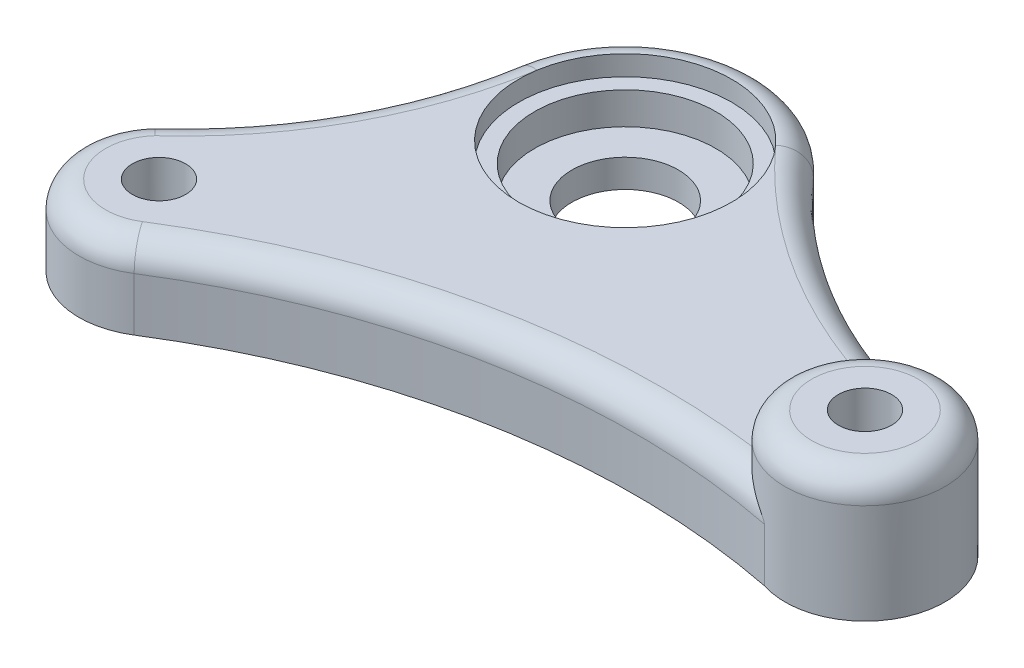
ISO-10303-21;
HEADER;
FILE_DESCRIPTION(('STEP AP214'),'2;1');
FILE_NAME('part.step','',(''),(''),'','','');
FILE_SCHEMA(('AUTOMOTIVE_DESIGN { 1 0 10303 214 1 1 1 1 }'));
ENDSEC;
DATA;
#1=APPLICATION_CONTEXT('core data for automotive mechanical design processes');
#2=APPLICATION_PROTOCOL_DEFINITION('international standard','automotive_design',2000,#1);
#3=PRODUCT_CONTEXT('',#1,'mechanical');
#4=PRODUCT('Part','Part','',(#3));
#5=PRODUCT_RELATED_PRODUCT_CATEGORY('part','',(#4));
#6=PRODUCT_DEFINITION_FORMATION('','',#4);
#7=PRODUCT_DEFINITION_CONTEXT('part definition',#1,'design');
#8=PRODUCT_DEFINITION('design','',#6,#7);
#9=PRODUCT_DEFINITION_SHAPE('','',#8);
#10=(LENGTH_UNIT() NAMED_UNIT(*) SI_UNIT(.MILLI.,.METRE.));
#11=(NAMED_UNIT(*) PLANE_ANGLE_UNIT() SI_UNIT($,.RADIAN.));
#12=(NAMED_UNIT(*) SI_UNIT($,.STERADIAN.) SOLID_ANGLE_UNIT());
#13=UNCERTAINTY_MEASURE_WITH_UNIT(LENGTH_MEASURE(1.E-05),#10,'distance_accuracy_value','');
#14=(GEOMETRIC_REPRESENTATION_CONTEXT(3) GLOBAL_UNCERTAINTY_ASSIGNED_CONTEXT((#13)) GLOBAL_UNIT_ASSIGNED_CONTEXT((#10,
#11,#12)) REPRESENTATION_CONTEXT('',''));
#15=CARTESIAN_POINT('',(0.,0.,0.));
#16=DIRECTION('',(0.,0.,1.));
#17=DIRECTION('',(1.,0.,0.));
#18=AXIS2_PLACEMENT_3D('',#15,#16,#17);
#19=CARTESIAN_POINT('',(30.,-6.,12.));
#20=DIRECTION('',(0.,1.,0.));
#21=DIRECTION('',(0.,0.,1.));
#22=AXIS2_PLACEMENT_3D('',#19,#20,#21);
#23=CYLINDRICAL_SURFACE('',#22,2.);
#24=CARTESIAN_POINT('',(30.,9.5,12.));
#25=DIRECTION('',(0.,1.,0.));
#26=DIRECTION('',(0.,0.,1.));
#27=AXIS2_PLACEMENT_3D('',#24,#25,#26);
#28=CIRCLE('',#27,2.);
#29=CARTESIAN_POINT('',(30.,9.5,14.));
#30=VERTEX_POINT('',#29);
#31=EDGE_CURVE('E241',#30,#30,#28,.T.);
#32=ORIENTED_EDGE('',*,*,#31,.T.);
#33=EDGE_LOOP('',(#32));
#34=FACE_BOUND('',#33,.T.);
#35=CARTESIAN_POINT('',(30.,2.,12.));
#36=DIRECTION('',(0.,-1.,0.));
#37=DIRECTION('',(0.,0.,-1.));
#38=AXIS2_PLACEMENT_3D('',#35,#36,#37);
#39=CIRCLE('',#38,2.);
#40=CARTESIAN_POINT('',(30.,2.,10.));
#41=VERTEX_POINT('',#40);
#42=EDGE_CURVE('E48',#41,#41,#39,.F.);
#43=ORIENTED_EDGE('',*,*,#42,.F.);
#44=EDGE_LOOP('',(#43));
#45=FACE_BOUND('',#44,.T.);
#46=ADVANCED_FACE('F43',(#34,#45),#23,.F.);
#47=CARTESIAN_POINT('',(-15.,-6.,20.));
#48=DIRECTION('',(0.,1.,0.));
#49=DIRECTION('',(0.,0.,1.));
#50=AXIS2_PLACEMENT_3D('',#47,#48,#49);
#51=CYLINDRICAL_SURFACE('',#50,2.);
#52=CARTESIAN_POINT('',(-15.,6.,20.));
#53=DIRECTION('',(0.,1.,0.));
#54=DIRECTION('',(0.,0.,1.));
#55=AXIS2_PLACEMENT_3D('',#52,#53,#54);
#56=CIRCLE('',#55,2.);
#57=CARTESIAN_POINT('',(-15.,6.,22.));
#58=VERTEX_POINT('',#57);
#59=EDGE_CURVE('E288',#58,#58,#56,.T.);
#60=ORIENTED_EDGE('',*,*,#59,.T.);
#61=EDGE_LOOP('',(#60));
#62=FACE_BOUND('',#61,.T.);
#63=CARTESIAN_POINT('',(-15.,2.,20.));
#64=DIRECTION('',(0.,-1.,0.));
#65=DIRECTION('',(0.,0.,-1.));
#66=AXIS2_PLACEMENT_3D('',#63,#64,#65);
#67=CIRCLE('',#66,2.);
#68=CARTESIAN_POINT('',(-15.,2.,18.));
#69=VERTEX_POINT('',#68);
#70=EDGE_CURVE('E249',#69,#69,#67,.F.);
#71=ORIENTED_EDGE('',*,*,#70,.F.);
#72=EDGE_LOOP('',(#71));
#73=FACE_BOUND('',#72,.T.);
#74=ADVANCED_FACE('F350',(#62,#73),#51,.F.);
#75=CARTESIAN_POINT('',(0.,-6.,0.));
#76=DIRECTION('',(0.,1.,0.));
#77=DIRECTION('',(0.,0.,1.));
#78=AXIS2_PLACEMENT_3D('',#75,#76,#77);
#79=CYLINDRICAL_SURFACE('',#78,4.);
#80=CARTESIAN_POINT('',(0.,0.,0.));
#81=DIRECTION('',(0.,1.,0.));
#82=DIRECTION('',(0.,0.,1.));
#83=AXIS2_PLACEMENT_3D('',#80,#81,#82);
#84=CIRCLE('',#83,4.);
#85=CARTESIAN_POINT('',(0.,0.,4.));
#86=VERTEX_POINT('',#85);
#87=EDGE_CURVE('E292',#86,#86,#84,.T.);
#88=ORIENTED_EDGE('',*,*,#87,.F.);
#89=EDGE_LOOP('',(#88));
#90=FACE_BOUND('',#89,.T.);
#91=CARTESIAN_POINT('',(0.,2.1,0.));
#92=DIRECTION('',(0.,1.,0.));
#93=DIRECTION('',(0.,0.,1.));
#94=AXIS2_PLACEMENT_3D('',#91,#92,#93);
#95=CIRCLE('',#94,4.);
#96=CARTESIAN_POINT('',(0.,2.1,4.));
#97=VERTEX_POINT('',#96);
#98=EDGE_CURVE('E141',#97,#97,#95,.F.);
#99=ORIENTED_EDGE('',*,*,#98,.F.);
#100=EDGE_LOOP('',(#99));
#101=FACE_BOUND('',#100,.T.);
#102=ADVANCED_FACE('F212',(#90,#101),#79,.F.);
#103=CARTESIAN_POINT('',(-15.,6.,20.));
#104=DIRECTION('',(0.,-1.,0.));
#105=DIRECTION('',(0.,0.,-1.));
#106=AXIS2_PLACEMENT_3D('',#103,#104,#105);
#107=CYLINDRICAL_SURFACE('',#106,6.);
#108=DIRECTION('',(0.,-1.,0.));
#109=VECTOR('',#108,1.);
#110=CARTESIAN_POINT('',(-11.7911078254641,6.,25.0698137058675));
#111=LINE('',#110,#109);
#112=CARTESIAN_POINT('',(-11.7911078254641,4.,25.0698137058675));
#113=VERTEX_POINT('',#112);
#114=CARTESIAN_POINT('',(-11.7911078254641,0.,25.0698137058675));
#115=VERTEX_POINT('',#114);
#116=EDGE_CURVE('E332',#113,#115,#111,.T.);
#117=ORIENTED_EDGE('',*,*,#116,.F.);
#118=CARTESIAN_POINT('',(-15.,4.,20.));
#119=DIRECTION('',(0.,1.,0.));
#120=DIRECTION('',(0.,0.,1.));
#121=AXIS2_PLACEMENT_3D('',#118,#119,#120);
#122=CIRCLE('',#121,6.);
#123=CARTESIAN_POINT('',(-19.3894219726827,4.,15.9094041087233));
#124=VERTEX_POINT('',#123);
#125=EDGE_CURVE('E62',#113,#124,#122,.F.);
#126=ORIENTED_EDGE('',*,*,#125,.T.);
#127=DIRECTION('',(0.,-1.,0.));
#128=VECTOR('',#127,1.);
#129=CARTESIAN_POINT('',(-19.3894219726827,6.,15.9094041087233));
#130=LINE('',#129,#128);
#131=CARTESIAN_POINT('',(-19.3894219726827,0.,15.9094041087233));
#132=VERTEX_POINT('',#131);
#133=EDGE_CURVE('E317',#124,#132,#130,.T.);
#134=ORIENTED_EDGE('',*,*,#133,.T.);
#135=CARTESIAN_POINT('',(-15.,0.,20.));
#136=DIRECTION('',(0.,1.,0.));
#137=DIRECTION('',(0.,0.,1.));
#138=AXIS2_PLACEMENT_3D('',#135,#136,#137);
#139=CIRCLE('',#138,6.);
#140=EDGE_CURVE('E293',#132,#115,#139,.T.);
#141=ORIENTED_EDGE('',*,*,#140,.T.);
#142=EDGE_LOOP('',(#117,#126,#134,#141));
#143=FACE_BOUND('',#142,.T.);
#144=ADVANCED_FACE('F209',(#143),#107,.T.);
#145=CARTESIAN_POINT('',(17.4436155004631,6.,71.6566246297384));
#146=DIRECTION('',(0.,-1.,0.));
#147=DIRECTION('',(0.,0.,-1.));
#148=AXIS2_PLACEMENT_3D('',#145,#146,#147);
#149=CYLINDRICAL_SURFACE('',#148,55.);
#150=DIRECTION('',(0.,-1.,0.));
#151=VECTOR('',#150,1.);
#152=CARTESIAN_POINT('',(28.1586438163136,6.,17.7104647275681));
#153=LINE('',#152,#151);
#154=CARTESIAN_POINT('',(28.1586438163136,4.,17.7104647275681));
#155=VERTEX_POINT('',#154);
#156=CARTESIAN_POINT('',(28.1586438163136,0.,17.7104647275681));
#157=VERTEX_POINT('',#156);
#158=EDGE_CURVE('E329',#155,#157,#153,.T.);
#159=ORIENTED_EDGE('',*,*,#158,.F.);
#160=CARTESIAN_POINT('',(17.4436155004631,4.,71.6566246297384));
#161=DIRECTION('',(0.,1.,0.));
#162=DIRECTION('',(0.,0.,1.));
#163=AXIS2_PLACEMENT_3D('',#160,#161,#162);
#164=CIRCLE('',#163,55.);
#165=EDGE_CURVE('E70',#155,#113,#164,.T.);
#166=ORIENTED_EDGE('',*,*,#165,.T.);
#167=ORIENTED_EDGE('',*,*,#116,.T.);
#168=CARTESIAN_POINT('',(17.4436155004631,0.,71.6566246297384));
#169=DIRECTION('',(0.,1.,0.));
#170=DIRECTION('',(0.,0.,1.));
#171=AXIS2_PLACEMENT_3D('',#168,#169,#170);
#172=CIRCLE('',#171,55.);
#173=EDGE_CURVE('E297',#115,#157,#172,.F.);
#174=ORIENTED_EDGE('',*,*,#173,.T.);
#175=EDGE_LOOP('',(#159,#166,#167,#174));
#176=FACE_BOUND('',#175,.T.);
#177=ADVANCED_FACE('F203',(#176),#149,.F.);
#178=CARTESIAN_POINT('',(30.,6.,12.));
#179=DIRECTION('',(0.,-1.,0.));
#180=DIRECTION('',(0.,0.,-1.));
#181=AXIS2_PLACEMENT_3D('',#178,#179,#180);
#182=CYLINDRICAL_SURFACE('',#181,6.);
#183=CARTESIAN_POINT('',(30.,7.5,12.));
#184=DIRECTION('',(0.,1.,0.));
#185=DIRECTION('',(0.,0.,1.));
#186=AXIS2_PLACEMENT_3D('',#183,#184,#185);
#187=CIRCLE('',#186,6.);
#188=CARTESIAN_POINT('',(30.,7.5,18.));
#189=VERTEX_POINT('',#188);
#190=EDGE_CURVE('E158',#189,#189,#187,.F.);
#191=ORIENTED_EDGE('',*,*,#190,.T.);
#192=EDGE_LOOP('',(#191));
#193=FACE_BOUND('',#192,.T.);
#194=CARTESIAN_POINT('',(30.,0.,12.));
#195=DIRECTION('',(0.,1.,0.));
#196=DIRECTION('',(0.,0.,1.));
#197=AXIS2_PLACEMENT_3D('',#194,#195,#196);
#198=CIRCLE('',#197,6.);
#199=CARTESIAN_POINT('',(30.9358441673114,0.,6.07343305998242));
#200=VERTEX_POINT('',#199);
#201=EDGE_CURVE('E301',#157,#200,#198,.T.);
#202=ORIENTED_EDGE('',*,*,#201,.T.);
#203=DIRECTION('',(0.,-1.,0.));
#204=VECTOR('',#203,1.);
#205=CARTESIAN_POINT('',(30.9358441673114,6.,6.07343305998242));
#206=LINE('',#205,#204);
#207=CARTESIAN_POINT('',(30.9358441673114,4.,6.07343305998242));
#208=VERTEX_POINT('',#207);
#209=EDGE_CURVE('E326',#208,#200,#206,.T.);
#210=ORIENTED_EDGE('',*,*,#209,.F.);
#211=CARTESIAN_POINT('',(26.4422950298681,6.,7.1685679819024));
#212=CARTESIAN_POINT('',(26.5108958757786,5.99999217569696,7.11804353439624));
#213=CARTESIAN_POINT('',(26.5805182447149,5.99669757475214,7.0690394379751));
#214=CARTESIAN_POINT('',(26.7213162048496,5.98424512800573,6.97432567219821));
#215=CARTESIAN_POINT('',(26.7924893122863,5.97509607541142,6.92861117632336));
#216=CARTESIAN_POINT('',(27.0065840147243,5.94013063010631,6.7973773681705));
#217=CARTESIAN_POINT('',(27.1513656207753,5.90676885624995,6.71682617980917));
#218=CARTESIAN_POINT('',(27.4142861444252,5.8327201310213,6.58416075317519));
#219=CARTESIAN_POINT('',(27.5320152639609,5.79479751815587,6.52957495178523));
#220=CARTESIAN_POINT('',(27.7683245052312,5.71090841476885,6.42899426657882));
#221=CARTESIAN_POINT('',(27.8869049446484,5.66493875383245,6.38300278361419));
#222=CARTESIAN_POINT('',(28.1250472683951,5.56625312238299,6.29907003803959));
#223=CARTESIAN_POINT('',(28.2446105904401,5.51349601455972,6.261181961654));
#224=CARTESIAN_POINT('',(28.4836174790928,5.40276695810095,6.19345063681758));
#225=CARTESIAN_POINT('',(28.6030609950147,5.34479334293644,6.16360997154757));
#226=CARTESIAN_POINT('',(28.9093741033857,5.19057574289728,6.09684795470304));
#227=CARTESIAN_POINT('',(29.0959643577461,5.09131484729659,6.06554858421318));
#228=CARTESIAN_POINT('',(29.4675695584835,4.88593307766774,6.02073808936542));
#229=CARTESIAN_POINT('',(29.6525832800202,4.77980733817671,6.00723972966211));
#230=CARTESIAN_POINT('',(30.0200402080417,4.56363667308852,5.99722673180348));
#231=CARTESIAN_POINT('',(30.2024891149856,4.45360341712494,6.00066515532779));
#232=CARTESIAN_POINT('',(30.5649755963695,4.23157225614716,6.02390174380439));
#233=CARTESIAN_POINT('',(30.7450149353054,4.11957594513975,6.04368718716028));
#234=CARTESIAN_POINT('',(30.9277553080385,4.00506977207821,6.07216002283774));
#235=CARTESIAN_POINT('',(30.9318000834242,4.00253487353446,6.07279447736328));
#236=CARTESIAN_POINT('',(30.9358441673114,4.,6.07343305998243));
#237=B_SPLINE_CURVE_WITH_KNOTS('',3,(#211,#212,#213,#214,#215,#216,#217,#218,#219,#220,#221,
#222,#223,#224,#225,#226,#227,#228,#229,#230,#231,#232,#233,#234,#235,#236),.UNSPECIFIED.,.F.,
.F.,(4,2,2,2,2,2,2,2,2,2,2,2,4),(0.,0.255385771181485,0.510388858229094,1.01566647395163,
1.42075062472454,1.82599473318959,2.23382212959463,2.64178028125969,3.28170942922309,
3.92209720512653,4.56071122114324,5.19882872182945,5.21327502967067),.UNSPECIFIED.);
#238=CARTESIAN_POINT('',(26.4422950298681,6.,7.16856798190241));
#239=VERTEX_POINT('',#238);
#240=EDGE_CURVE('E54',#208,#239,#237,.F.);
#241=ORIENTED_EDGE('',*,*,#240,.T.);
#242=CARTESIAN_POINT('',(30.,6.,12.));
#243=DIRECTION('',(0.,1.,0.));
#244=DIRECTION('',(0.,0.,1.));
#245=AXIS2_PLACEMENT_3D('',#242,#243,#244);
#246=CIRCLE('',#245,6.00000000000001);
#247=CARTESIAN_POINT('',(24.8904060283416,6.,15.1451628645894));
#248=VERTEX_POINT('',#247);
#249=EDGE_CURVE('E284',#239,#248,#246,.T.);
#250=ORIENTED_EDGE('',*,*,#249,.T.);
#251=CARTESIAN_POINT('',(24.8904060283416,6.,15.1451628645894));
#252=CARTESIAN_POINT('',(24.9350907138842,5.99999177827061,15.2177707781572));
#253=CARTESIAN_POINT('',(24.9812949605894,5.99672034602002,15.2893520849093));
#254=CARTESIAN_POINT('',(25.0763890334649,5.98434450237474,15.4300491162784));
#255=CARTESIAN_POINT('',(25.1252749387603,5.97524840982728,15.4991682090762));
#256=CARTESIAN_POINT('',(25.2745225600292,5.94050140147986,15.7010316268782));
#257=CARTESIAN_POINT('',(25.3784682125814,5.90736015850638,15.8298887931349));
#258=CARTESIAN_POINT('',(25.5713736778087,5.83403095417712,16.0501970422286));
#259=CARTESIAN_POINT('',(25.6589769631615,5.79672515881643,16.143867150894));
#260=CARTESIAN_POINT('',(25.8380578960126,5.7141185854472,16.3236935256364));
#261=CARTESIAN_POINT('',(25.929536053862,5.66881675179415,16.4098487973507));
#262=CARTESIAN_POINT('',(26.1164689836124,5.57125410299326,16.5753593481222));
#263=CARTESIAN_POINT('',(26.2119510906596,5.51893704284602,16.6546501122954));
#264=CARTESIAN_POINT('',(26.4055505116716,5.4088087709354,16.8057260647295));
#265=CARTESIAN_POINT('',(26.503666838965,5.3509995962531,16.8775140152721));
#266=CARTESIAN_POINT('',(26.7066961008739,5.22790128335715,17.0169723115143));
#267=CARTESIAN_POINT('',(26.8117125387491,5.16238897907748,17.0842941815693));
#268=CARTESIAN_POINT('',(27.0235866597142,5.02671908388953,17.2111642374054));
#269=CARTESIAN_POINT('',(27.1304460496322,4.95655699449815,17.2707047245318));
#270=CARTESIAN_POINT('',(27.3442111909491,4.81219588829214,17.3815527476057));
#271=CARTESIAN_POINT('',(27.4511091804475,4.73803525588056,17.4329245771852));
#272=CARTESIAN_POINT('',(27.6104960985715,4.62202477855988,17.5039680781531));
#273=CARTESIAN_POINT('',(27.6634254113257,4.58259130411859,17.5266320052796));
#274=CARTESIAN_POINT('',(27.7683570754099,4.50140615141847,17.5698263838116));
#275=CARTESIAN_POINT('',(27.8203600223645,4.45965603940688,17.5903582503463));
#276=CARTESIAN_POINT('',(27.8967711321539,4.39378868417968,17.6193582464276));
#277=CARTESIAN_POINT('',(27.9221043213015,4.37116542102414,17.6287697441994));
#278=CARTESIAN_POINT('',(27.9718101282554,4.32427327316187,17.6468704341825));
#279=CARTESIAN_POINT('',(27.9961763211684,4.29999560338493,17.6555551195099));
#280=CARTESIAN_POINT('',(28.0432117609887,4.24880996020457,17.6720021337495));
#281=CARTESIAN_POINT('',(28.0658488763957,4.22186706905944,17.6797480918579));
#282=CARTESIAN_POINT('',(28.1066282414198,4.16436309728332,17.6934690813816));
#283=CARTESIAN_POINT('',(28.1248143816706,4.1338421372865,17.6994615296081));
#284=CARTESIAN_POINT('',(28.1434108867269,4.08752583215734,17.7055335589106));
#285=CARTESIAN_POINT('',(28.1479808679185,4.07365221339113,17.7070165476091));
#286=CARTESIAN_POINT('',(28.1548281613115,4.04531335593032,17.7092341032794));
#287=CARTESIAN_POINT('',(28.1571139421689,4.03085051102534,17.7099714348923));
#288=CARTESIAN_POINT('',(28.1584635727716,4.01087795062992,17.7104065604111));
#289=CARTESIAN_POINT('',(28.1586488920822,4.00543846583889,17.7104662539403));
#290=CARTESIAN_POINT('',(28.1586438163135,3.99999999999999,17.7104647275681));
#291=B_SPLINE_CURVE_WITH_KNOTS('',3,(#251,#252,#253,#254,#255,#256,#257,#258,#259,#260,#261,
#262,#263,#264,#265,#266,#267,#268,#269,#270,#271,#272,#273,#274,#275,#276,#277,#278,#279,#280,
#281,#282,#283,#284,#285,#286,#287,#288,#289,#290),.UNSPECIFIED.,.F.,.F.,(4,2,2,2,2,2,2,2,2,2,2,
2,2,2,2,2,2,2,2,4),(0.,0.255561321339974,0.510758458658444,1.01554313663848,1.41575412885678,
1.81601799688139,2.21970783531791,2.62324852136169,3.04562045508821,3.46840715681079,
3.8876811173219,4.0970018733704,4.30618279512726,4.41188602286503,4.51820244485692,
4.62616568133997,4.73301702813965,4.77689896328708,4.82061759607541,4.83693379396565),.UNSPECIFIED.);
#292=EDGE_CURVE('E11',#248,#155,#291,.T.);
#293=ORIENTED_EDGE('',*,*,#292,.T.);
#294=ORIENTED_EDGE('',*,*,#158,.T.);
#295=EDGE_LOOP('',(#202,#210,#241,#250,#293,#294));
#296=FACE_BOUND('',#295,.T.);
#297=ADVANCED_FACE('F197',(#193,#296),#182,.T.);
#298=CARTESIAN_POINT('',(37.1748052827206,6.,-33.4370132068014));
#299=DIRECTION('',(0.,-1.,0.));
#300=DIRECTION('',(0.,0.,-1.));
#301=AXIS2_PLACEMENT_3D('',#298,#299,#300);
#302=CYLINDRICAL_SURFACE('',#301,40.);
#303=DIRECTION('',(0.,-1.,0.));
#304=VECTOR('',#303,1.);
#305=CARTESIAN_POINT('',(7.43496105654411,6.,-6.68740264136028));
#306=LINE('',#305,#304);
#307=CARTESIAN_POINT('',(7.43496105654411,4.,-6.68740264136028));
#308=VERTEX_POINT('',#307);
#309=CARTESIAN_POINT('',(7.43496105654411,0.,-6.68740264136028));
#310=VERTEX_POINT('',#309);
#311=EDGE_CURVE('E323',#308,#310,#306,.T.);
#312=ORIENTED_EDGE('',*,*,#311,.F.);
#313=CARTESIAN_POINT('',(37.1748052827206,4.,-33.4370132068014));
#314=DIRECTION('',(0.,1.,0.));
#315=DIRECTION('',(0.,0.,1.));
#316=AXIS2_PLACEMENT_3D('',#313,#314,#315);
#317=CIRCLE('',#316,40.);
#318=EDGE_CURVE('E174',#308,#208,#317,.T.);
#319=ORIENTED_EDGE('',*,*,#318,.T.);
#320=ORIENTED_EDGE('',*,*,#209,.T.);
#321=CARTESIAN_POINT('',(37.1748052827206,0.,-33.4370132068014));
#322=DIRECTION('',(0.,1.,0.));
#323=DIRECTION('',(0.,0.,1.));
#324=AXIS2_PLACEMENT_3D('',#321,#322,#323);
#325=CIRCLE('',#324,40.);
#326=EDGE_CURVE('E305',#310,#200,#325,.T.);
#327=ORIENTED_EDGE('',*,*,#326,.F.);
#328=EDGE_LOOP('',(#312,#319,#320,#327));
#329=FACE_BOUND('',#328,.T.);
#330=ADVANCED_FACE('F202',(#329),#302,.F.);
#331=CARTESIAN_POINT('',(0.,6.,0.));
#332=DIRECTION('',(0.,-1.,0.));
#333=DIRECTION('',(0.,0.,-1.));
#334=AXIS2_PLACEMENT_3D('',#331,#332,#333);
#335=CYLINDRICAL_SURFACE('',#334,10.);
#336=DIRECTION('',(0.,-1.,0.));
#337=VECTOR('',#336,1.);
#338=CARTESIAN_POINT('',(-9.87279170885826,6.,-1.58996348181324));
#339=LINE('',#338,#337);
#340=CARTESIAN_POINT('',(-9.87279170885826,4.,-1.58996348181324));
#341=VERTEX_POINT('',#340);
#342=CARTESIAN_POINT('',(-9.87279170885826,0.,-1.58996348181324));
#343=VERTEX_POINT('',#342);
#344=EDGE_CURVE('E320',#341,#343,#339,.T.);
#345=ORIENTED_EDGE('',*,*,#344,.F.);
#346=CARTESIAN_POINT('',(0.,4.,0.));
#347=DIRECTION('',(0.,1.,0.));
#348=DIRECTION('',(0.,0.,1.));
#349=AXIS2_PLACEMENT_3D('',#346,#347,#348);
#350=CIRCLE('',#349,10.);
#351=EDGE_CURVE('E147',#341,#308,#350,.F.);
#352=ORIENTED_EDGE('',*,*,#351,.T.);
#353=ORIENTED_EDGE('',*,*,#311,.T.);
#354=CARTESIAN_POINT('',(0.,0.,0.));
#355=DIRECTION('',(0.,1.,0.));
#356=DIRECTION('',(0.,0.,1.));
#357=AXIS2_PLACEMENT_3D('',#354,#355,#356);
#358=CIRCLE('',#357,10.);
#359=EDGE_CURVE('E309',#310,#343,#358,.T.);
#360=ORIENTED_EDGE('',*,*,#359,.T.);
#361=EDGE_LOOP('',(#345,#352,#353,#360));
#362=FACE_BOUND('',#361,.T.);
#363=ADVANCED_FACE('F398',(#362),#335,.T.);
#364=CARTESIAN_POINT('',(-39.491166835433,6.,-6.35985392725297));
#365=DIRECTION('',(0.,-1.,0.));
#366=DIRECTION('',(0.,0.,-1.));
#367=AXIS2_PLACEMENT_3D('',#364,#365,#366);
#368=CYLINDRICAL_SURFACE('',#367,30.);
#369=ORIENTED_EDGE('',*,*,#133,.F.);
#370=CARTESIAN_POINT('',(-39.491166835433,4.,-6.35985392725297));
#371=DIRECTION('',(0.,1.,0.));
#372=DIRECTION('',(0.,0.,1.));
#373=AXIS2_PLACEMENT_3D('',#370,#371,#372);
#374=CIRCLE('',#373,30.);
#375=EDGE_CURVE('E181',#124,#341,#374,.T.);
#376=ORIENTED_EDGE('',*,*,#375,.T.);
#377=ORIENTED_EDGE('',*,*,#344,.T.);
#378=CARTESIAN_POINT('',(-39.491166835433,0.,-6.35985392725297));
#379=DIRECTION('',(0.,1.,0.));
#380=DIRECTION('',(0.,0.,1.));
#381=AXIS2_PLACEMENT_3D('',#378,#379,#380);
#382=CIRCLE('',#381,30.);
#383=EDGE_CURVE('E313',#343,#132,#382,.F.);
#384=ORIENTED_EDGE('',*,*,#383,.T.);
#385=EDGE_LOOP('',(#369,#376,#377,#384));
#386=FACE_BOUND('',#385,.T.);
#387=ADVANCED_FACE('F393',(#386),#368,.F.);
#388=CARTESIAN_POINT('',(0.,6.,0.));
#389=DIRECTION('',(0.,1.,0.));
#390=DIRECTION('',(0.,0.,1.));
#391=AXIS2_PLACEMENT_3D('',#388,#389,#390);
#392=PLANE('',#391);
#393=CARTESIAN_POINT('',(0.,6.,0.));
#394=DIRECTION('',(0.,1.,0.));
#395=DIRECTION('',(0.,0.,1.));
#396=AXIS2_PLACEMENT_3D('',#393,#394,#395);
#397=CIRCLE('',#396,8.);
#398=CARTESIAN_POINT('',(-7.8982333670866,6.,-1.27197078545059));
#399=VERTEX_POINT('',#398);
#400=CARTESIAN_POINT('',(5.94796884523529,6.,-5.34992211308822));
#401=VERTEX_POINT('',#400);
#402=EDGE_CURVE('E120',#399,#401,#397,.T.);
#403=ORIENTED_EDGE('',*,*,#402,.F.);
#404=CARTESIAN_POINT('',(-39.491166835433,6.,-6.35985392725297));
#405=DIRECTION('',(0.,1.,0.));
#406=DIRECTION('',(0.,0.,1.));
#407=AXIS2_PLACEMENT_3D('',#404,#405,#406);
#408=CIRCLE('',#407,32.);
#409=CARTESIAN_POINT('',(-17.9777635368213,6.,17.3292464885772));
#410=VERTEX_POINT('',#409);
#411=EDGE_CURVE('E133',#399,#410,#408,.F.);
#412=ORIENTED_EDGE('',*,*,#411,.T.);
#413=CARTESIAN_POINT('',(-15.,6.,20.));
#414=DIRECTION('',(0.,1.,0.));
#415=DIRECTION('',(0.,0.,1.));
#416=AXIS2_PLACEMENT_3D('',#413,#414,#415);
#417=CIRCLE('',#416,4.);
#418=CARTESIAN_POINT('',(-12.8578277153273,6.,23.3780316610092));
#419=VERTEX_POINT('',#418);
#420=EDGE_CURVE('E127',#410,#419,#417,.T.);
#421=ORIENTED_EDGE('',*,*,#420,.T.);
#422=CARTESIAN_POINT('',(17.4436155004631,6.,71.6566246297384));
#423=DIRECTION('',(0.,1.,0.));
#424=DIRECTION('',(0.,0.,1.));
#425=AXIS2_PLACEMENT_3D('',#422,#423,#424);
#426=CIRCLE('',#425,57.);
#427=EDGE_CURVE('E126',#419,#248,#426,.F.);
#428=ORIENTED_EDGE('',*,*,#427,.T.);
#429=ORIENTED_EDGE('',*,*,#249,.F.);
#430=CARTESIAN_POINT('',(37.1748052827206,6.,-33.4370132068014));
#431=DIRECTION('',(0.,1.,0.));
#432=DIRECTION('',(0.,0.,1.));
#433=AXIS2_PLACEMENT_3D('',#430,#431,#432);
#434=CIRCLE('',#433,42.);
#435=EDGE_CURVE('E137',#239,#401,#434,.F.);
#436=ORIENTED_EDGE('',*,*,#435,.T.);
#437=EDGE_LOOP('',(#403,#412,#421,#428,#429,#436));
#438=FACE_BOUND('',#437,.T.);
#439=ORIENTED_EDGE('',*,*,#59,.F.);
#440=EDGE_LOOP('',(#439));
#441=FACE_BOUND('',#440,.T.);
#442=ADVANCED_FACE('F130',(#438,#441),#392,.T.);
#443=CARTESIAN_POINT('',(0.,0.,0.));
#444=DIRECTION('',(0.,1.,0.));
#445=DIRECTION('',(0.,0.,1.));
#446=AXIS2_PLACEMENT_3D('',#443,#444,#445);
#447=PLANE('',#446);
#448=CARTESIAN_POINT('',(-15.,0.,20.));
#449=DIRECTION('',(0.,-1.,0.));
#450=DIRECTION('',(0.,0.,-1.));
#451=AXIS2_PLACEMENT_3D('',#448,#449,#450);
#452=CIRCLE('',#451,4.);
#453=CARTESIAN_POINT('',(-15.,0.,16.));
#454=VERTEX_POINT('',#453);
#455=EDGE_CURVE('E259',#454,#454,#452,.T.);
#456=ORIENTED_EDGE('',*,*,#455,.F.);
#457=EDGE_LOOP('',(#456));
#458=FACE_BOUND('',#457,.T.);
#459=CARTESIAN_POINT('',(30.,0.,12.));
#460=DIRECTION('',(0.,-1.,0.));
#461=DIRECTION('',(0.,0.,-1.));
#462=AXIS2_PLACEMENT_3D('',#459,#460,#461);
#463=CIRCLE('',#462,4.00000000000001);
#464=CARTESIAN_POINT('',(30.,0.,7.99999999999999));
#465=VERTEX_POINT('',#464);
#466=EDGE_CURVE('E271',#465,#465,#463,.T.);
#467=ORIENTED_EDGE('',*,*,#466,.F.);
#468=EDGE_LOOP('',(#467));
#469=FACE_BOUND('',#468,.T.);
#470=ORIENTED_EDGE('',*,*,#87,.T.);
#471=EDGE_LOOP('',(#470));
#472=FACE_BOUND('',#471,.T.);
#473=ORIENTED_EDGE('',*,*,#140,.F.);
#474=ORIENTED_EDGE('',*,*,#383,.F.);
#475=ORIENTED_EDGE('',*,*,#359,.F.);
#476=ORIENTED_EDGE('',*,*,#326,.T.);
#477=ORIENTED_EDGE('',*,*,#201,.F.);
#478=ORIENTED_EDGE('',*,*,#173,.F.);
#479=EDGE_LOOP('',(#473,#474,#475,#476,#477,#478));
#480=FACE_BOUND('',#479,.T.);
#481=ADVANCED_FACE('F344',(#458,#469,#472,#480),#447,.F.);
#482=CARTESIAN_POINT('',(30.,9.5,12.));
#483=DIRECTION('',(0.,1.,0.));
#484=DIRECTION('',(0.,0.,1.));
#485=AXIS2_PLACEMENT_3D('',#482,#483,#484);
#486=PLANE('',#485);
#487=CARTESIAN_POINT('',(30.,9.5,12.));
#488=DIRECTION('',(0.,1.,0.));
#489=DIRECTION('',(0.,0.,1.));
#490=AXIS2_PLACEMENT_3D('',#487,#488,#489);
#491=CIRCLE('',#490,4.);
#492=CARTESIAN_POINT('',(30.,9.5,16.));
#493=VERTEX_POINT('',#492);
#494=EDGE_CURVE('E164',#493,#493,#491,.T.);
#495=ORIENTED_EDGE('',*,*,#494,.T.);
#496=EDGE_LOOP('',(#495));
#497=FACE_BOUND('',#496,.T.);
#498=ORIENTED_EDGE('',*,*,#31,.F.);
#499=EDGE_LOOP('',(#498));
#500=FACE_BOUND('',#499,.T.);
#501=ADVANCED_FACE('F216',(#497,#500),#486,.T.);
#502=CARTESIAN_POINT('',(30.,7.5,12.));
#503=DIRECTION('',(0.,1.,0.));
#504=DIRECTION('',(0.,0.,1.));
#505=AXIS2_PLACEMENT_3D('',#502,#503,#504);
#506=TOROIDAL_SURFACE('',#505,4.,2.);
#507=ORIENTED_EDGE('',*,*,#190,.F.);
#508=EDGE_LOOP('',(#507));
#509=FACE_BOUND('',#508,.T.);
#510=ORIENTED_EDGE('',*,*,#494,.F.);
#511=EDGE_LOOP('',(#510));
#512=FACE_BOUND('',#511,.T.);
#513=ADVANCED_FACE('F213',(#509,#512),#506,.T.);
#514=CARTESIAN_POINT('',(17.4436155004631,4.,71.6566246297384));
#515=DIRECTION('',(0.,1.,0.));
#516=DIRECTION('',(0.,0.,1.));
#517=AXIS2_PLACEMENT_3D('',#514,#515,#516);
#518=TOROIDAL_SURFACE('',#517,57.,2.);
#519=ORIENTED_EDGE('',*,*,#292,.F.);
#520=ORIENTED_EDGE('',*,*,#427,.F.);
#521=CARTESIAN_POINT('',(-11.7911078254641,4.,25.0698137058675));
#522=CARTESIAN_POINT('',(-11.7911080302923,4.05626710525654,25.0698133900522));
#523=CARTESIAN_POINT('',(-11.7923746501833,4.11250725221659,25.0678036160553));
#524=CARTESIAN_POINT('',(-11.7974277419173,4.2245851415795,25.0597858226768));
#525=CARTESIAN_POINT('',(-11.801214093281,4.28042290309314,25.0537779944595));
#526=CARTESIAN_POINT('',(-11.8163176647403,4.44664416557117,25.0298132073527));
#527=CARTESIAN_POINT('',(-11.8313794961307,4.55591416697634,25.0059147965116));
#528=CARTESIAN_POINT('',(-11.8710713383014,4.76815774187134,24.9429380428254));
#529=CARTESIAN_POINT('',(-11.895705988479,4.87112823430008,24.9038523395695));
#530=CARTESIAN_POINT('',(-11.9538401148715,5.0678386820884,24.8116195330216));
#531=CARTESIAN_POINT('',(-11.9873372143155,5.16158110303848,24.758476199768));
#532=CARTESIAN_POINT('',(-12.0622447842277,5.33717771197457,24.6396410263127));
#533=CARTESIAN_POINT('',(-12.1036544641178,5.41903308620705,24.5739504397586));
#534=CARTESIAN_POINT('',(-12.1932407036657,5.56858546445194,24.4318435625391));
#535=CARTESIAN_POINT('',(-12.2414204296367,5.63627580647016,24.3554222531859));
#536=CARTESIAN_POINT('',(-12.3431795223977,5.7555529032876,24.1940270588161));
#537=CARTESIAN_POINT('',(-12.396761587444,5.8071315576984,24.1090489000165));
#538=CARTESIAN_POINT('',(-12.5077463455817,5.8926207183133,23.9330488157841));
#539=CARTESIAN_POINT('',(-12.5651433119042,5.92655706172641,23.8420359498699));
#540=CARTESIAN_POINT('',(-12.6506312384926,5.96262453852779,23.7064935944823));
#541=CARTESIAN_POINT('',(-12.6778966746687,5.97204724867031,23.6632658034069));
#542=CARTESIAN_POINT('',(-12.7327172778643,5.98688234050888,23.5763551012138));
#543=CARTESIAN_POINT('',(-12.7602721187985,5.99229882826601,23.5326727027425));
#544=CARTESIAN_POINT('',(-12.8111751258651,5.99856766447181,23.4519808454547));
#545=CARTESIAN_POINT('',(-12.8345029284276,6.00000410719071,23.4150030169197));
#546=CARTESIAN_POINT('',(-12.8578277153284,6.,23.3780316610106));
#547=B_SPLINE_CURVE_WITH_KNOTS('',3,(#521,#522,#523,#524,#525,#526,#527,#528,#529,#530,#531,
#532,#533,#534,#535,#536,#537,#538,#539,#540,#541,#542,#543,#544,#545,#546),.UNSPECIFIED.,.F.,
.F.,(4,2,2,2,2,2,2,2,2,2,2,2,4),(0.,0.168697633514965,0.33738720144147,0.674237586355911,
1.01125142738792,1.34817497800933,1.6850648828111,2.02211287686349,2.35933005503209,
2.69605197659621,2.85183618525031,3.0074605053161,3.13859549408311),.UNSPECIFIED.);
#548=EDGE_CURVE('E233',#113,#419,#547,.T.);
#549=ORIENTED_EDGE('',*,*,#548,.F.);
#550=ORIENTED_EDGE('',*,*,#165,.F.);
#551=EDGE_LOOP('',(#519,#520,#549,#550));
#552=FACE_BOUND('',#551,.T.);
#553=ADVANCED_FACE('F45',(#552),#518,.T.);
#554=CARTESIAN_POINT('',(-15.,4.,20.));
#555=DIRECTION('',(0.,1.,0.));
#556=DIRECTION('',(0.,0.,1.));
#557=AXIS2_PLACEMENT_3D('',#554,#555,#556);
#558=TOROIDAL_SURFACE('',#557,4.,2.);
#559=ORIENTED_EDGE('',*,*,#548,.T.);
#560=ORIENTED_EDGE('',*,*,#420,.F.);
#561=CARTESIAN_POINT('',(-19.3894219726827,4.,15.9094041087233));
#562=CARTESIAN_POINT('',(-19.3894216419382,4.05622791299938,15.9094042764554));
#563=CARTESIAN_POINT('',(-19.3877560760825,4.11242887537104,15.9110967024313));
#564=CARTESIAN_POINT('',(-19.3811110205039,4.22442840940427,15.917847824758));
#565=CARTESIAN_POINT('',(-19.3761316947288,4.28022700083502,15.9229063545714));
#566=CARTESIAN_POINT('',(-19.3562689391387,4.44632684300969,15.9430823570813));
#567=CARTESIAN_POINT('',(-19.3364606072107,4.55551500557152,15.9632003773444));
#568=CARTESIAN_POINT('',(-19.2842491350852,4.76759719763115,16.0161957351555));
#569=CARTESIAN_POINT('',(-19.2518400959583,4.87048825303447,16.0490790486715));
#570=CARTESIAN_POINT('',(-19.1753327724456,5.06705400371759,16.1266392691687));
#571=CARTESIAN_POINT('',(-19.1312371660932,5.16073080375372,16.1713134742006));
#572=CARTESIAN_POINT('',(-19.0325629864968,5.33625277454665,16.2711719226969));
#573=CARTESIAN_POINT('',(-18.9779809982664,5.4180940757049,16.3263595899174));
#574=CARTESIAN_POINT('',(-18.8598357865448,5.56762624153673,16.4456539212987));
#575=CARTESIAN_POINT('',(-18.796269584956,5.63531239552262,16.5097635428109));
#576=CARTESIAN_POINT('',(-18.6618701111943,5.75465621208723,16.6450942072064));
#577=CARTESIAN_POINT('',(-18.5910285923975,5.80629541247759,16.7163233175808));
#578=CARTESIAN_POINT('',(-18.4441307306143,5.89195367262996,16.8637491233998));
#579=CARTESIAN_POINT('',(-18.3680789064636,5.92598778737583,16.9399415115018));
#580=CARTESIAN_POINT('',(-18.2425085004121,5.96609810262923,17.0654783846292));
#581=CARTESIAN_POINT('',(-18.1939098407692,5.97788515040271,17.1140023581984));
#582=CARTESIAN_POINT('',(-18.0960882277382,5.9942477869252,17.211537309427));
#583=CARTESIAN_POINT('',(-18.0468663634891,5.99883456885029,17.2605474117639));
#584=CARTESIAN_POINT('',(-17.9909915897773,5.99993509363755,17.3160989280997));
#585=CARTESIAN_POINT('',(-17.9843775454532,6.00000017127995,17.3226733918149));
#586=CARTESIAN_POINT('',(-17.9777635368213,6.,17.3292464885772));
#587=B_SPLINE_CURVE_WITH_KNOTS('',3,(#561,#562,#563,#564,#565,#566,#567,#568,#569,#570,#571,
#572,#573,#574,#575,#576,#577,#578,#579,#580,#581,#582,#583,#584,#585,#586),.UNSPECIFIED.,.F.,
.F.,(4,2,2,2,2,2,2,2,2,2,2,2,4),(0.,0.168580089092134,0.337151838331166,0.673753789283179,
1.0105135080904,1.34719612340867,1.68398856893532,2.0208929177993,2.35818345572149,
2.69518508091226,2.90390364465783,3.11229742242382,3.14027421229264),.UNSPECIFIED.);
#588=EDGE_CURVE('E156',#124,#410,#587,.T.);
#589=ORIENTED_EDGE('',*,*,#588,.F.);
#590=ORIENTED_EDGE('',*,*,#125,.F.);
#591=EDGE_LOOP('',(#559,#560,#589,#590));
#592=FACE_BOUND('',#591,.T.);
#593=ADVANCED_FACE('F223',(#592),#558,.T.);
#594=CARTESIAN_POINT('',(37.1748052827206,4.,-33.4370132068014));
#595=DIRECTION('',(0.,1.,0.));
#596=DIRECTION('',(0.,0.,1.));
#597=AXIS2_PLACEMENT_3D('',#594,#595,#596);
#598=TOROIDAL_SURFACE('',#597,42.,2.);
#599=ORIENTED_EDGE('',*,*,#240,.F.);
#600=ORIENTED_EDGE('',*,*,#318,.F.);
#601=CARTESIAN_POINT('',(5.9479688452353,4.,-5.34992211308823));
#602=DIRECTION('',(-0.668740264136028,0.,-0.743496105654412));
#603=DIRECTION('',(-0.743496105654412,0.,0.668740264136028));
#604=AXIS2_PLACEMENT_3D('',#601,#602,#603);
#605=CIRCLE('',#604,2.);
#606=EDGE_CURVE('E151',#401,#308,#605,.T.);
#607=ORIENTED_EDGE('',*,*,#606,.F.);
#608=ORIENTED_EDGE('',*,*,#435,.F.);
#609=EDGE_LOOP('',(#599,#600,#607,#608));
#610=FACE_BOUND('',#609,.T.);
#611=ADVANCED_FACE('F194',(#610),#598,.T.);
#612=CARTESIAN_POINT('',(-39.491166835433,4.,-6.35985392725297));
#613=DIRECTION('',(0.,1.,0.));
#614=DIRECTION('',(0.,0.,1.));
#615=AXIS2_PLACEMENT_3D('',#612,#613,#614);
#616=TOROIDAL_SURFACE('',#615,32.,2.);
#617=ORIENTED_EDGE('',*,*,#588,.T.);
#618=ORIENTED_EDGE('',*,*,#411,.F.);
#619=CARTESIAN_POINT('',(-7.89823336708661,4.,-1.27197078545059));
#620=DIRECTION('',(0.158996348181324,0.,-0.987279170885826));
#621=DIRECTION('',(-0.987279170885826,0.,-0.158996348181324));
#622=AXIS2_PLACEMENT_3D('',#619,#620,#621);
#623=CIRCLE('',#622,2.);
#624=EDGE_CURVE('E145',#341,#399,#623,.T.);
#625=ORIENTED_EDGE('',*,*,#624,.F.);
#626=ORIENTED_EDGE('',*,*,#375,.F.);
#627=EDGE_LOOP('',(#617,#618,#625,#626));
#628=FACE_BOUND('',#627,.T.);
#629=ADVANCED_FACE('F154',(#628),#616,.T.);
#630=CARTESIAN_POINT('',(0.,4.,0.));
#631=DIRECTION('',(0.,1.,0.));
#632=DIRECTION('',(0.,0.,1.));
#633=AXIS2_PLACEMENT_3D('',#630,#631,#632);
#634=TOROIDAL_SURFACE('',#633,8.,2.);
#635=ORIENTED_EDGE('',*,*,#606,.T.);
#636=ORIENTED_EDGE('',*,*,#351,.F.);
#637=ORIENTED_EDGE('',*,*,#624,.T.);
#638=CARTESIAN_POINT('',(0.,6.,0.));
#639=DIRECTION('',(0.,1.,0.));
#640=DIRECTION('',(0.,0.,1.));
#641=AXIS2_PLACEMENT_3D('',#638,#639,#640);
#642=CIRCLE('',#641,8.);
#643=EDGE_CURVE('E117',#401,#399,#642,.T.);
#644=ORIENTED_EDGE('',*,*,#643,.F.);
#645=EDGE_LOOP('',(#635,#636,#637,#644));
#646=FACE_BOUND('',#645,.T.);
#647=ADVANCED_FACE('F146',(#646),#634,.T.);
#648=CARTESIAN_POINT('',(0.,4.5,0.));
#649=DIRECTION('',(0.,1.,0.));
#650=DIRECTION('',(0.,0.,1.));
#651=AXIS2_PLACEMENT_3D('',#648,#649,#650);
#652=PLANE('',#651);
#653=CARTESIAN_POINT('',(0.,4.5,0.));
#654=DIRECTION('',(0.,1.,0.));
#655=DIRECTION('',(0.,0.,1.));
#656=AXIS2_PLACEMENT_3D('',#653,#654,#655);
#657=CIRCLE('',#656,6.8);
#658=CARTESIAN_POINT('',(0.,4.5,6.8));
#659=VERTEX_POINT('',#658);
#660=EDGE_CURVE('E242',#659,#659,#657,.T.);
#661=ORIENTED_EDGE('',*,*,#660,.F.);
#662=EDGE_LOOP('',(#661));
#663=FACE_BOUND('',#662,.T.);
#664=CARTESIAN_POINT('',(0.,4.5,0.));
#665=DIRECTION('',(0.,1.,0.));
#666=DIRECTION('',(0.,0.,1.));
#667=AXIS2_PLACEMENT_3D('',#664,#665,#666);
#668=CIRCLE('',#667,8.);
#669=CARTESIAN_POINT('',(0.,4.5,8.));
#670=VERTEX_POINT('',#669);
#671=EDGE_CURVE('E140',#670,#670,#668,.T.);
#672=ORIENTED_EDGE('',*,*,#671,.T.);
#673=EDGE_LOOP('',(#672));
#674=FACE_BOUND('',#673,.T.);
#675=ADVANCED_FACE('F220',(#663,#674),#652,.T.);
#676=CARTESIAN_POINT('',(0.,4.5,0.));
#677=DIRECTION('',(0.,1.,0.));
#678=DIRECTION('',(0.,0.,1.));
#679=AXIS2_PLACEMENT_3D('',#676,#677,#678);
#680=CYLINDRICAL_SURFACE('',#679,8.);
#681=ORIENTED_EDGE('',*,*,#671,.F.);
#682=EDGE_LOOP('',(#681));
#683=FACE_BOUND('',#682,.T.);
#684=ORIENTED_EDGE('',*,*,#643,.T.);
#685=ORIENTED_EDGE('',*,*,#402,.T.);
#686=EDGE_LOOP('',(#684,#685));
#687=FACE_BOUND('',#686,.T.);
#688=ADVANCED_FACE('F119',(#683,#687),#680,.F.);
#689=CARTESIAN_POINT('',(0.,2.1,0.));
#690=DIRECTION('',(0.,1.,0.));
#691=DIRECTION('',(0.,0.,1.));
#692=AXIS2_PLACEMENT_3D('',#689,#690,#691);
#693=PLANE('',#692);
#694=CARTESIAN_POINT('',(0.,2.1,0.));
#695=DIRECTION('',(0.,1.,0.));
#696=DIRECTION('',(0.,0.,1.));
#697=AXIS2_PLACEMENT_3D('',#694,#695,#696);
#698=CIRCLE('',#697,6.8);
#699=CARTESIAN_POINT('',(0.,2.1,6.8));
#700=VERTEX_POINT('',#699);
#701=EDGE_CURVE('E246',#700,#700,#698,.T.);
#702=ORIENTED_EDGE('',*,*,#701,.T.);
#703=EDGE_LOOP('',(#702));
#704=FACE_BOUND('',#703,.T.);
#705=ORIENTED_EDGE('',*,*,#98,.T.);
#706=EDGE_LOOP('',(#705));
#707=FACE_BOUND('',#706,.T.);
#708=ADVANCED_FACE('F371',(#704,#707),#693,.T.);
#709=CARTESIAN_POINT('',(0.,2.1,0.));
#710=DIRECTION('',(0.,1.,0.));
#711=DIRECTION('',(0.,0.,1.));
#712=AXIS2_PLACEMENT_3D('',#709,#710,#711);
#713=CYLINDRICAL_SURFACE('',#712,6.8);
#714=ORIENTED_EDGE('',*,*,#660,.T.);
#715=EDGE_LOOP('',(#714));
#716=FACE_BOUND('',#715,.T.);
#717=ORIENTED_EDGE('',*,*,#701,.F.);
#718=EDGE_LOOP('',(#717));
#719=FACE_BOUND('',#718,.T.);
#720=ADVANCED_FACE('F374',(#716,#719),#713,.F.);
#721=CARTESIAN_POINT('',(-15.,2.,20.));
#722=DIRECTION('',(0.,-1.,0.));
#723=DIRECTION('',(0.,0.,-1.));
#724=AXIS2_PLACEMENT_3D('',#721,#722,#723);
#725=PLANE('',#724);
#726=CARTESIAN_POINT('',(-15.,2.,20.));
#727=DIRECTION('',(0.,-1.,0.));
#728=DIRECTION('',(0.,0.,-1.));
#729=AXIS2_PLACEMENT_3D('',#726,#727,#728);
#730=CIRCLE('',#729,4.);
#731=CARTESIAN_POINT('',(-15.,2.,16.));
#732=VERTEX_POINT('',#731);
#733=EDGE_CURVE('E252',#732,#732,#730,.T.);
#734=ORIENTED_EDGE('',*,*,#733,.T.);
#735=EDGE_LOOP('',(#734));
#736=FACE_BOUND('',#735,.T.);
#737=ORIENTED_EDGE('',*,*,#70,.T.);
#738=EDGE_LOOP('',(#737));
#739=FACE_BOUND('',#738,.T.);
#740=ADVANCED_FACE('F366',(#736,#739),#725,.T.);
#741=CARTESIAN_POINT('',(-15.,2.,20.));
#742=DIRECTION('',(0.,-1.,0.));
#743=DIRECTION('',(0.,0.,-1.));
#744=AXIS2_PLACEMENT_3D('',#741,#742,#743);
#745=CYLINDRICAL_SURFACE('',#744,4.);
#746=ORIENTED_EDGE('',*,*,#733,.F.);
#747=EDGE_LOOP('',(#746));
#748=FACE_BOUND('',#747,.T.);
#749=ORIENTED_EDGE('',*,*,#455,.T.);
#750=EDGE_LOOP('',(#749));
#751=FACE_BOUND('',#750,.T.);
#752=ADVANCED_FACE('F357',(#748,#751),#745,.F.);
#753=CARTESIAN_POINT('',(30.,2.,12.));
#754=DIRECTION('',(0.,-1.,0.));
#755=DIRECTION('',(0.,0.,-1.));
#756=AXIS2_PLACEMENT_3D('',#753,#754,#755);
#757=PLANE('',#756);
#758=CARTESIAN_POINT('',(30.,2.,12.));
#759=DIRECTION('',(0.,-1.,0.));
#760=DIRECTION('',(0.,0.,-1.));
#761=AXIS2_PLACEMENT_3D('',#758,#759,#760);
#762=CIRCLE('',#761,4.00000000000001);
#763=CARTESIAN_POINT('',(30.,2.,7.99999999999999));
#764=VERTEX_POINT('',#763);
#765=EDGE_CURVE('E265',#764,#764,#762,.T.);
#766=ORIENTED_EDGE('',*,*,#765,.T.);
#767=EDGE_LOOP('',(#766));
#768=FACE_BOUND('',#767,.T.);
#769=ORIENTED_EDGE('',*,*,#42,.T.);
#770=EDGE_LOOP('',(#769));
#771=FACE_BOUND('',#770,.T.);
#772=ADVANCED_FACE('F354',(#768,#771),#757,.T.);
#773=CARTESIAN_POINT('',(30.,2.,12.));
#774=DIRECTION('',(0.,-1.,0.));
#775=DIRECTION('',(0.,0.,-1.));
#776=AXIS2_PLACEMENT_3D('',#773,#774,#775);
#777=CYLINDRICAL_SURFACE('',#776,4.00000000000001);
#778=ORIENTED_EDGE('',*,*,#765,.F.);
#779=EDGE_LOOP('',(#778));
#780=FACE_BOUND('',#779,.T.);
#781=ORIENTED_EDGE('',*,*,#466,.T.);
#782=EDGE_LOOP('',(#781));
#783=FACE_BOUND('',#782,.T.);
#784=ADVANCED_FACE('F356',(#780,#783),#777,.F.);
#785=CLOSED_SHELL('',(#46,#74,#102,#144,#177,#297,#330,#363,#387,#442,#481,#501,#513,#553,#593,
#611,#629,#647,#675,#688,#708,#720,#740,#752,#772,#784));
#786=MANIFOLD_SOLID_BREP('B2',#785);
#787=ADVANCED_BREP_SHAPE_REPRESENTATION('',(#18,#786),#14);
#788=SHAPE_DEFINITION_REPRESENTATION(#9,#787);
ENDSEC;
END-ISO-10303-21;
